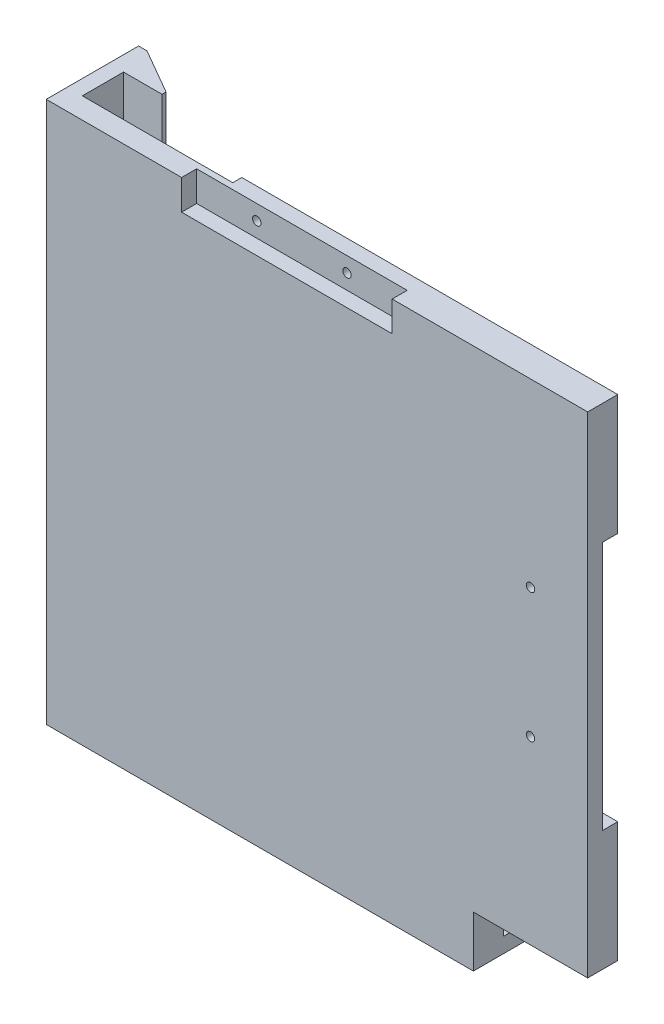
ISO-10303-21;
HEADER;
FILE_DESCRIPTION(('STEP AP214'),'2;1');
FILE_NAME('part.step','',(''),(''),'','','');
FILE_SCHEMA(('AUTOMOTIVE_DESIGN { 1 0 10303 214 1 1 1 1 }'));
ENDSEC;
DATA;
#1=APPLICATION_CONTEXT('core data for automotive mechanical design processes');
#2=APPLICATION_PROTOCOL_DEFINITION('international standard','automotive_design',2000,#1);
#3=PRODUCT_CONTEXT('',#1,'mechanical');
#4=PRODUCT('Part','Part','',(#3));
#5=PRODUCT_RELATED_PRODUCT_CATEGORY('part','',(#4));
#6=PRODUCT_DEFINITION_FORMATION('','',#4);
#7=PRODUCT_DEFINITION_CONTEXT('part definition',#1,'design');
#8=PRODUCT_DEFINITION('design','',#6,#7);
#9=PRODUCT_DEFINITION_SHAPE('','',#8);
#10=(LENGTH_UNIT() NAMED_UNIT(*) SI_UNIT(.MILLI.,.METRE.));
#11=(NAMED_UNIT(*) PLANE_ANGLE_UNIT() SI_UNIT($,.RADIAN.));
#12=(NAMED_UNIT(*) SI_UNIT($,.STERADIAN.) SOLID_ANGLE_UNIT());
#13=UNCERTAINTY_MEASURE_WITH_UNIT(LENGTH_MEASURE(1.E-05),#10,'distance_accuracy_value','');
#14=(GEOMETRIC_REPRESENTATION_CONTEXT(3) GLOBAL_UNCERTAINTY_ASSIGNED_CONTEXT((#13)) GLOBAL_UNIT_ASSIGNED_CONTEXT((#10,
#11,#12)) REPRESENTATION_CONTEXT('',''));
#15=CARTESIAN_POINT('',(0.,0.,0.));
#16=DIRECTION('',(0.,0.,1.));
#17=DIRECTION('',(1.,0.,0.));
#18=AXIS2_PLACEMENT_3D('',#15,#16,#17);
#19=CARTESIAN_POINT('',(180.,0.,30.7));
#20=DIRECTION('',(-1.,0.,0.));
#21=DIRECTION('',(0.,0.,1.));
#22=AXIS2_PLACEMENT_3D('',#19,#20,#21);
#23=PLANE('',#22);
#24=DIRECTION('',(0.,-1.,0.));
#25=VECTOR('',#24,1.);
#26=CARTESIAN_POINT('',(180.,57.01,25.7));
#27=LINE('',#26,#25);
#28=CARTESIAN_POINT('',(180.,140.,25.7));
#29=VERTEX_POINT('',#28);
#30=CARTESIAN_POINT('',(180.,57.01,25.7));
#31=VERTEX_POINT('',#30);
#32=EDGE_CURVE('E265',#29,#31,#27,.T.);
#33=ORIENTED_EDGE('',*,*,#32,.F.);
#34=DIRECTION('',(0.,0.,-1.));
#35=VECTOR('',#34,1.);
#36=CARTESIAN_POINT('',(180.,140.,25.7));
#37=LINE('',#36,#35);
#38=CARTESIAN_POINT('',(180.,140.,20.7));
#39=VERTEX_POINT('',#38);
#40=EDGE_CURVE('E285',#29,#39,#37,.T.);
#41=ORIENTED_EDGE('',*,*,#40,.T.);
#42=DIRECTION('',(0.,-1.,0.));
#43=VECTOR('',#42,1.);
#44=CARTESIAN_POINT('',(180.,17.01,20.7));
#45=LINE('',#44,#43);
#46=CARTESIAN_POINT('',(180.,180.,20.7));
#47=VERTEX_POINT('',#46);
#48=EDGE_CURVE('E337',#47,#39,#45,.T.);
#49=ORIENTED_EDGE('',*,*,#48,.F.);
#50=DIRECTION('',(0.,0.,-1.));
#51=VECTOR('',#50,1.);
#52=CARTESIAN_POINT('',(180.,180.,30.7));
#53=LINE('',#52,#51);
#54=CARTESIAN_POINT('',(180.,180.,30.7));
#55=VERTEX_POINT('',#54);
#56=EDGE_CURVE('E369',#55,#47,#53,.T.);
#57=ORIENTED_EDGE('',*,*,#56,.F.);
#58=DIRECTION('',(0.,1.,0.));
#59=VECTOR('',#58,1.);
#60=CARTESIAN_POINT('',(180.,0.,30.7));
#61=LINE('',#60,#59);
#62=CARTESIAN_POINT('',(180.,17.01,30.7));
#63=VERTEX_POINT('',#62);
#64=EDGE_CURVE('E354',#63,#55,#61,.T.);
#65=ORIENTED_EDGE('',*,*,#64,.F.);
#66=DIRECTION('',(0.,0.,-1.));
#67=VECTOR('',#66,1.);
#68=CARTESIAN_POINT('',(180.,17.01,30.7));
#69=LINE('',#68,#67);
#70=CARTESIAN_POINT('',(180.,17.01,20.7));
#71=VERTEX_POINT('',#70);
#72=EDGE_CURVE('E296',#63,#71,#69,.T.);
#73=ORIENTED_EDGE('',*,*,#72,.T.);
#74=CARTESIAN_POINT('',(180.,57.01,20.7));
#75=VERTEX_POINT('',#74);
#76=EDGE_CURVE('E336',#75,#71,#45,.T.);
#77=ORIENTED_EDGE('',*,*,#76,.F.);
#78=DIRECTION('',(0.,0.,-1.));
#79=VECTOR('',#78,1.);
#80=CARTESIAN_POINT('',(180.,57.01,25.7));
#81=LINE('',#80,#79);
#82=EDGE_CURVE('E278',#31,#75,#81,.T.);
#83=ORIENTED_EDGE('',*,*,#82,.F.);
#84=EDGE_LOOP('',(#33,#41,#49,#57,#65,#73,#77,#83));
#85=FACE_BOUND('',#84,.T.);
#86=ADVANCED_FACE('F41',(#85),#23,.F.);
#87=CARTESIAN_POINT('',(0.,0.,30.7));
#88=DIRECTION('',(1.,0.,0.));
#89=DIRECTION('',(0.,0.,-1.));
#90=AXIS2_PLACEMENT_3D('',#87,#88,#89);
#91=PLANE('',#90);
#92=DIRECTION('',(0.,-1.,0.));
#93=VECTOR('',#92,1.);
#94=CARTESIAN_POINT('',(0.,0.,0.));
#95=LINE('',#94,#93);
#96=CARTESIAN_POINT('',(0.,180.,0.));
#97=VERTEX_POINT('',#96);
#98=CARTESIAN_POINT('',(0.,0.,0.));
#99=VERTEX_POINT('',#98);
#100=EDGE_CURVE('E345',#97,#99,#95,.T.);
#101=ORIENTED_EDGE('',*,*,#100,.T.);
#102=DIRECTION('',(0.,0.,-1.));
#103=VECTOR('',#102,1.);
#104=CARTESIAN_POINT('',(0.,0.,30.7));
#105=LINE('',#104,#103);
#106=CARTESIAN_POINT('',(0.,0.,30.7));
#107=VERTEX_POINT('',#106);
#108=EDGE_CURVE('E372',#107,#99,#105,.T.);
#109=ORIENTED_EDGE('',*,*,#108,.F.);
#110=DIRECTION('',(0.,-1.,0.));
#111=VECTOR('',#110,1.);
#112=CARTESIAN_POINT('',(0.,0.,30.7));
#113=LINE('',#112,#111);
#114=CARTESIAN_POINT('',(0.,180.,30.7));
#115=VERTEX_POINT('',#114);
#116=EDGE_CURVE('E347',#115,#107,#113,.T.);
#117=ORIENTED_EDGE('',*,*,#116,.F.);
#118=DIRECTION('',(0.,0.,-1.));
#119=VECTOR('',#118,1.);
#120=CARTESIAN_POINT('',(0.,180.,30.7));
#121=LINE('',#120,#119);
#122=EDGE_CURVE('E360',#115,#97,#121,.T.);
#123=ORIENTED_EDGE('',*,*,#122,.T.);
#124=EDGE_LOOP('',(#101,#109,#117,#123));
#125=FACE_BOUND('',#124,.T.);
#126=ADVANCED_FACE('F503',(#125),#91,.F.);
#127=CARTESIAN_POINT('',(0.,0.,30.7));
#128=DIRECTION('',(0.,1.,0.));
#129=DIRECTION('',(0.,0.,1.));
#130=AXIS2_PLACEMENT_3D('',#127,#128,#129);
#131=PLANE('',#130);
#132=DIRECTION('',(1.,0.,0.));
#133=VECTOR('',#132,1.);
#134=CARTESIAN_POINT('',(0.,0.,0.));
#135=LINE('',#134,#133);
#136=CARTESIAN_POINT('',(142.,0.,0.));
#137=VERTEX_POINT('',#136);
#138=EDGE_CURVE('E363',#99,#137,#135,.T.);
#139=ORIENTED_EDGE('',*,*,#138,.T.);
#140=DIRECTION('',(0.,0.,-1.));
#141=VECTOR('',#140,1.);
#142=CARTESIAN_POINT('',(142.,0.,30.7));
#143=LINE('',#142,#141);
#144=CARTESIAN_POINT('',(142.,0.,30.7));
#145=VERTEX_POINT('',#144);
#146=EDGE_CURVE('E288',#145,#137,#143,.T.);
#147=ORIENTED_EDGE('',*,*,#146,.F.);
#148=DIRECTION('',(1.,0.,0.));
#149=VECTOR('',#148,1.);
#150=CARTESIAN_POINT('',(0.,0.,30.7));
#151=LINE('',#150,#149);
#152=EDGE_CURVE('E350',#107,#145,#151,.T.);
#153=ORIENTED_EDGE('',*,*,#152,.F.);
#154=ORIENTED_EDGE('',*,*,#108,.T.);
#155=EDGE_LOOP('',(#139,#147,#153,#154));
#156=FACE_BOUND('',#155,.T.);
#157=ADVANCED_FACE('F474',(#156),#131,.F.);
#158=CARTESIAN_POINT('',(0.,180.,30.7));
#159=DIRECTION('',(0.,-1.,0.));
#160=DIRECTION('',(0.,0.,-1.));
#161=AXIS2_PLACEMENT_3D('',#158,#159,#160);
#162=PLANE('',#161);
#163=DIRECTION('',(0.,0.,-1.));
#164=VECTOR('',#163,1.);
#165=CARTESIAN_POINT('',(17.79,180.,20.7));
#166=LINE('',#165,#164);
#167=CARTESIAN_POINT('',(17.79,180.,10.));
#168=VERTEX_POINT('',#167);
#169=CARTESIAN_POINT('',(17.79,180.,8.66025403784437));
#170=VERTEX_POINT('',#169);
#171=EDGE_CURVE('E343',#168,#170,#166,.T.);
#172=ORIENTED_EDGE('',*,*,#171,.T.);
#173=DIRECTION('',(-0.86602540378444,0.,-0.499999999999997));
#174=VECTOR('',#173,1.);
#175=CARTESIAN_POINT('',(17.79,180.,8.66025403784437));
#176=LINE('',#175,#174);
#177=CARTESIAN_POINT('',(2.7899999999999,180.,0.));
#178=VERTEX_POINT('',#177);
#179=EDGE_CURVE('E12',#170,#178,#176,.T.);
#180=ORIENTED_EDGE('',*,*,#179,.T.);
#181=DIRECTION('',(-1.,0.,0.));
#182=VECTOR('',#181,1.);
#183=CARTESIAN_POINT('',(0.,180.,0.));
#184=LINE('',#183,#182);
#185=EDGE_CURVE('E351',#178,#97,#184,.T.);
#186=ORIENTED_EDGE('',*,*,#185,.T.);
#187=ORIENTED_EDGE('',*,*,#122,.F.);
#188=DIRECTION('',(-1.,0.,0.));
#189=VECTOR('',#188,1.);
#190=CARTESIAN_POINT('',(0.,180.,30.7));
#191=LINE('',#190,#189);
#192=CARTESIAN_POINT('',(45.,180.,30.7));
#193=VERTEX_POINT('',#192);
#194=EDGE_CURVE('E356',#193,#115,#191,.T.);
#195=ORIENTED_EDGE('',*,*,#194,.F.);
#196=DIRECTION('',(0.,0.,1.));
#197=VECTOR('',#196,1.);
#198=CARTESIAN_POINT('',(45.,180.,25.7));
#199=LINE('',#198,#197);
#200=CARTESIAN_POINT('',(45.,180.,25.7));
#201=VERTEX_POINT('',#200);
#202=EDGE_CURVE('E239',#201,#193,#199,.T.);
#203=ORIENTED_EDGE('',*,*,#202,.F.);
#204=DIRECTION('',(-1.,0.,0.));
#205=VECTOR('',#204,1.);
#206=CARTESIAN_POINT('',(45.,180.,25.7));
#207=LINE('',#206,#205);
#208=CARTESIAN_POINT('',(115.,180.,25.7));
#209=VERTEX_POINT('',#208);
#210=EDGE_CURVE('E213',#209,#201,#207,.T.);
#211=ORIENTED_EDGE('',*,*,#210,.F.);
#212=DIRECTION('',(0.,0.,1.));
#213=VECTOR('',#212,1.);
#214=CARTESIAN_POINT('',(115.,180.,25.7));
#215=LINE('',#214,#213);
#216=CARTESIAN_POINT('',(115.,180.,30.7));
#217=VERTEX_POINT('',#216);
#218=EDGE_CURVE('E242',#209,#217,#215,.T.);
#219=ORIENTED_EDGE('',*,*,#218,.T.);
#220=EDGE_CURVE('E357',#55,#217,#191,.T.);
#221=ORIENTED_EDGE('',*,*,#220,.F.);
#222=ORIENTED_EDGE('',*,*,#56,.T.);
#223=DIRECTION('',(1.,0.,0.));
#224=VECTOR('',#223,1.);
#225=CARTESIAN_POINT('',(180.,180.,20.7));
#226=LINE('',#225,#224);
#227=CARTESIAN_POINT('',(55.,180.,20.7));
#228=VERTEX_POINT('',#227);
#229=EDGE_CURVE('E340',#228,#47,#226,.T.);
#230=ORIENTED_EDGE('',*,*,#229,.F.);
#231=DIRECTION('',(0.,0.,-1.));
#232=VECTOR('',#231,1.);
#233=CARTESIAN_POINT('',(55.,180.,23.7));
#234=LINE('',#233,#232);
#235=CARTESIAN_POINT('',(55.,180.,23.7));
#236=VERTEX_POINT('',#235);
#237=EDGE_CURVE('E258',#236,#228,#234,.T.);
#238=ORIENTED_EDGE('',*,*,#237,.F.);
#239=DIRECTION('',(1.,0.,0.));
#240=VECTOR('',#239,1.);
#241=CARTESIAN_POINT('',(5.,180.,23.7));
#242=LINE('',#241,#240);
#243=CARTESIAN_POINT('',(5.,180.,23.7));
#244=VERTEX_POINT('',#243);
#245=EDGE_CURVE('E249',#244,#236,#242,.T.);
#246=ORIENTED_EDGE('',*,*,#245,.F.);
#247=DIRECTION('',(0.,0.,1.));
#248=VECTOR('',#247,1.);
#249=CARTESIAN_POINT('',(5.,180.,20.7));
#250=LINE('',#249,#248);
#251=CARTESIAN_POINT('',(5.,180.,10.));
#252=VERTEX_POINT('',#251);
#253=EDGE_CURVE('E327',#252,#244,#250,.T.);
#254=ORIENTED_EDGE('',*,*,#253,.F.);
#255=DIRECTION('',(-1.,0.,0.));
#256=VECTOR('',#255,1.);
#257=CARTESIAN_POINT('',(180.,180.,10.));
#258=LINE('',#257,#256);
#259=EDGE_CURVE('E318',#168,#252,#258,.T.);
#260=ORIENTED_EDGE('',*,*,#259,.F.);
#261=EDGE_LOOP('',(#172,#180,#186,#187,#195,#203,#211,#219,#221,#222,#230,#238,#246,#254,#260));
#262=FACE_BOUND('',#261,.T.);
#263=ADVANCED_FACE('F441',(#262),#162,.F.);
#264=CARTESIAN_POINT('',(0.,0.,30.7));
#265=DIRECTION('',(0.,0.,-1.));
#266=DIRECTION('',(-1.,0.,0.));
#267=AXIS2_PLACEMENT_3D('',#264,#265,#266);
#268=PLANE('',#267);
#269=CARTESIAN_POINT('',(161.,77.01,30.7));
#270=DIRECTION('',(0.,0.,-1.));
#271=DIRECTION('',(-1.,0.,0.));
#272=AXIS2_PLACEMENT_3D('',#269,#270,#271);
#273=CIRCLE('',#272,1.40000000000003);
#274=CARTESIAN_POINT('',(159.6,77.01,30.7));
#275=VERTEX_POINT('',#274);
#276=EDGE_CURVE('E231',#275,#275,#273,.T.);
#277=ORIENTED_EDGE('',*,*,#276,.T.);
#278=EDGE_LOOP('',(#277));
#279=FACE_BOUND('',#278,.T.);
#280=CARTESIAN_POINT('',(161.,120.,30.7));
#281=DIRECTION('',(0.,0.,-1.));
#282=DIRECTION('',(-1.,0.,0.));
#283=AXIS2_PLACEMENT_3D('',#280,#281,#282);
#284=CIRCLE('',#283,1.40000000000003);
#285=CARTESIAN_POINT('',(159.6,120.,30.7));
#286=VERTEX_POINT('',#285);
#287=EDGE_CURVE('E398',#286,#286,#284,.T.);
#288=ORIENTED_EDGE('',*,*,#287,.T.);
#289=EDGE_LOOP('',(#288));
#290=FACE_BOUND('',#289,.T.);
#291=DIRECTION('',(1.,0.,0.));
#292=VECTOR('',#291,1.);
#293=CARTESIAN_POINT('',(45.,170.,30.7));
#294=LINE('',#293,#292);
#295=CARTESIAN_POINT('',(45.,170.,30.7));
#296=VERTEX_POINT('',#295);
#297=CARTESIAN_POINT('',(115.,170.,30.7));
#298=VERTEX_POINT('',#297);
#299=EDGE_CURVE('E228',#296,#298,#294,.T.);
#300=ORIENTED_EDGE('',*,*,#299,.F.);
#301=DIRECTION('',(0.,-1.,0.));
#302=VECTOR('',#301,1.);
#303=CARTESIAN_POINT('',(45.,170.,30.7));
#304=LINE('',#303,#302);
#305=EDGE_CURVE('E208',#193,#296,#304,.T.);
#306=ORIENTED_EDGE('',*,*,#305,.F.);
#307=ORIENTED_EDGE('',*,*,#194,.T.);
#308=ORIENTED_EDGE('',*,*,#116,.T.);
#309=ORIENTED_EDGE('',*,*,#152,.T.);
#310=DIRECTION('',(0.,-1.,0.));
#311=VECTOR('',#310,1.);
#312=CARTESIAN_POINT('',(142.,65.8617144018508,30.7));
#313=LINE('',#312,#311);
#314=CARTESIAN_POINT('',(142.,17.01,30.7));
#315=VERTEX_POINT('',#314);
#316=EDGE_CURVE('E303',#315,#145,#313,.T.);
#317=ORIENTED_EDGE('',*,*,#316,.F.);
#318=DIRECTION('',(1.,0.,0.));
#319=VECTOR('',#318,1.);
#320=CARTESIAN_POINT('',(180.,17.01,30.7));
#321=LINE('',#320,#319);
#322=EDGE_CURVE('E300',#315,#63,#321,.T.);
#323=ORIENTED_EDGE('',*,*,#322,.T.);
#324=ORIENTED_EDGE('',*,*,#64,.T.);
#325=ORIENTED_EDGE('',*,*,#220,.T.);
#326=DIRECTION('',(0.,1.,0.));
#327=VECTOR('',#326,1.);
#328=CARTESIAN_POINT('',(115.,170.,30.7));
#329=LINE('',#328,#327);
#330=EDGE_CURVE('E226',#298,#217,#329,.T.);
#331=ORIENTED_EDGE('',*,*,#330,.F.);
#332=EDGE_LOOP('',(#300,#306,#307,#308,#309,#317,#323,#324,#325,#331));
#333=FACE_BOUND('',#332,.T.);
#334=ADVANCED_FACE('F468',(#279,#290,#333),#268,.F.);
#335=CARTESIAN_POINT('',(0.,0.,0.));
#336=DIRECTION('',(0.,0.,-1.));
#337=DIRECTION('',(-1.,0.,0.));
#338=AXIS2_PLACEMENT_3D('',#335,#336,#337);
#339=PLANE('',#338);
#340=DIRECTION('',(0.,-1.,0.));
#341=VECTOR('',#340,1.);
#342=CARTESIAN_POINT('',(2.7899999999999,17.01,0.));
#343=LINE('',#342,#341);
#344=CARTESIAN_POINT('',(2.7899999999999,2.0099999999999,0.));
#345=VERTEX_POINT('',#344);
#346=EDGE_CURVE('E65',#178,#345,#343,.T.);
#347=ORIENTED_EDGE('',*,*,#346,.T.);
#348=DIRECTION('',(1.,0.,0.));
#349=VECTOR('',#348,1.);
#350=CARTESIAN_POINT('',(142.,2.0099999999999,0.));
#351=LINE('',#350,#349);
#352=CARTESIAN_POINT('',(142.,2.0099999999999,0.));
#353=VERTEX_POINT('',#352);
#354=EDGE_CURVE('E384',#345,#353,#351,.T.);
#355=ORIENTED_EDGE('',*,*,#354,.T.);
#356=DIRECTION('',(0.,-1.,0.));
#357=VECTOR('',#356,1.);
#358=CARTESIAN_POINT('',(142.,65.8617144018508,0.));
#359=LINE('',#358,#357);
#360=EDGE_CURVE('E304',#353,#137,#359,.T.);
#361=ORIENTED_EDGE('',*,*,#360,.T.);
#362=ORIENTED_EDGE('',*,*,#138,.F.);
#363=ORIENTED_EDGE('',*,*,#100,.F.);
#364=ORIENTED_EDGE('',*,*,#185,.F.);
#365=EDGE_LOOP('',(#347,#355,#361,#362,#363,#364));
#366=FACE_BOUND('',#365,.T.);
#367=ADVANCED_FACE('F477',(#366),#339,.T.);
#368=CARTESIAN_POINT('',(17.79,17.01,20.7));
#369=DIRECTION('',(-1.,0.,0.));
#370=DIRECTION('',(0.,0.,1.));
#371=AXIS2_PLACEMENT_3D('',#368,#369,#370);
#372=PLANE('',#371);
#373=DIRECTION('',(0.,0.,-1.));
#374=VECTOR('',#373,1.);
#375=CARTESIAN_POINT('',(17.79,17.01,20.7));
#376=LINE('',#375,#374);
#377=CARTESIAN_POINT('',(17.79,17.01,10.));
#378=VERTEX_POINT('',#377);
#379=CARTESIAN_POINT('',(17.79,17.01,8.66025403784437));
#380=VERTEX_POINT('',#379);
#381=EDGE_CURVE('E342',#378,#380,#376,.T.);
#382=ORIENTED_EDGE('',*,*,#381,.T.);
#383=DIRECTION('',(0.,1.,0.));
#384=VECTOR('',#383,1.);
#385=CARTESIAN_POINT('',(17.79,180.,8.66025403784437));
#386=LINE('',#385,#384);
#387=EDGE_CURVE('E50',#380,#170,#386,.T.);
#388=ORIENTED_EDGE('',*,*,#387,.T.);
#389=ORIENTED_EDGE('',*,*,#171,.F.);
#390=DIRECTION('',(0.,-1.,0.));
#391=VECTOR('',#390,1.);
#392=CARTESIAN_POINT('',(17.79,17.01,10.));
#393=LINE('',#392,#391);
#394=EDGE_CURVE('E333',#168,#378,#393,.T.);
#395=ORIENTED_EDGE('',*,*,#394,.T.);
#396=EDGE_LOOP('',(#382,#388,#389,#395));
#397=FACE_BOUND('',#396,.T.);
#398=ADVANCED_FACE('F486',(#397),#372,.F.);
#399=CARTESIAN_POINT('',(180.,17.01,20.7));
#400=DIRECTION('',(0.,-1.,0.));
#401=DIRECTION('',(0.,0.,-1.));
#402=AXIS2_PLACEMENT_3D('',#399,#400,#401);
#403=PLANE('',#402);
#404=DIRECTION('',(0.,0.,1.));
#405=VECTOR('',#404,1.);
#406=CARTESIAN_POINT('',(142.,17.01,30.7));
#407=LINE('',#406,#405);
#408=CARTESIAN_POINT('',(142.,17.01,8.66025403784437));
#409=VERTEX_POINT('',#408);
#410=CARTESIAN_POINT('',(142.,17.01,10.));
#411=VERTEX_POINT('',#410);
#412=EDGE_CURVE('E294',#409,#411,#407,.T.);
#413=ORIENTED_EDGE('',*,*,#412,.F.);
#414=DIRECTION('',(-1.,0.,0.));
#415=VECTOR('',#414,1.);
#416=CARTESIAN_POINT('',(17.79,17.01,8.66025403784437));
#417=LINE('',#416,#415);
#418=EDGE_CURVE('E380',#409,#380,#417,.T.);
#419=ORIENTED_EDGE('',*,*,#418,.T.);
#420=ORIENTED_EDGE('',*,*,#381,.F.);
#421=DIRECTION('',(1.,0.,0.));
#422=VECTOR('',#421,1.);
#423=CARTESIAN_POINT('',(180.,17.01,10.));
#424=LINE('',#423,#422);
#425=EDGE_CURVE('E375',#378,#411,#424,.T.);
#426=ORIENTED_EDGE('',*,*,#425,.T.);
#427=EDGE_LOOP('',(#413,#419,#420,#426));
#428=FACE_BOUND('',#427,.T.);
#429=ADVANCED_FACE('F419',(#428),#403,.F.);
#430=CARTESIAN_POINT('',(0.,0.,20.7));
#431=DIRECTION('',(0.,0.,1.));
#432=DIRECTION('',(1.,0.,0.));
#433=AXIS2_PLACEMENT_3D('',#430,#431,#432);
#434=PLANE('',#433);
#435=CARTESIAN_POINT('',(95.,175.,20.7));
#436=DIRECTION('',(0.,0.,-1.));
#437=DIRECTION('',(-1.,0.,0.));
#438=AXIS2_PLACEMENT_3D('',#435,#436,#437);
#439=CIRCLE('',#438,1.39999999999997);
#440=CARTESIAN_POINT('',(93.6,175.,20.7));
#441=VERTEX_POINT('',#440);
#442=EDGE_CURVE('E408',#441,#441,#439,.T.);
#443=ORIENTED_EDGE('',*,*,#442,.F.);
#444=EDGE_LOOP('',(#443));
#445=FACE_BOUND('',#444,.T.);
#446=CARTESIAN_POINT('',(65.,175.,20.7));
#447=DIRECTION('',(0.,0.,-1.));
#448=DIRECTION('',(-1.,0.,0.));
#449=AXIS2_PLACEMENT_3D('',#446,#447,#448);
#450=CIRCLE('',#449,1.40000000000002);
#451=CARTESIAN_POINT('',(63.6,175.,20.7));
#452=VERTEX_POINT('',#451);
#453=EDGE_CURVE('E394',#452,#452,#450,.T.);
#454=ORIENTED_EDGE('',*,*,#453,.F.);
#455=EDGE_LOOP('',(#454));
#456=FACE_BOUND('',#455,.T.);
#457=DIRECTION('',(-1.,0.,0.));
#458=VECTOR('',#457,1.);
#459=CARTESIAN_POINT('',(180.,5.,20.7));
#460=LINE('',#459,#458);
#461=CARTESIAN_POINT('',(142.,5.,20.7));
#462=VERTEX_POINT('',#461);
#463=CARTESIAN_POINT('',(55.,5.,20.7));
#464=VERTEX_POINT('',#463);
#465=EDGE_CURVE('E321',#462,#464,#460,.T.);
#466=ORIENTED_EDGE('',*,*,#465,.T.);
#467=DIRECTION('',(0.,-1.,0.));
#468=VECTOR('',#467,1.);
#469=CARTESIAN_POINT('',(55.,5.,20.7));
#470=LINE('',#469,#468);
#471=EDGE_CURVE('E241',#228,#464,#470,.T.);
#472=ORIENTED_EDGE('',*,*,#471,.F.);
#473=ORIENTED_EDGE('',*,*,#229,.T.);
#474=ORIENTED_EDGE('',*,*,#48,.T.);
#475=DIRECTION('',(1.,0.,0.));
#476=VECTOR('',#475,1.);
#477=CARTESIAN_POINT('',(180.,140.,20.7));
#478=LINE('',#477,#476);
#479=CARTESIAN_POINT('',(142.,140.,20.7));
#480=VERTEX_POINT('',#479);
#481=EDGE_CURVE('E269',#480,#39,#478,.T.);
#482=ORIENTED_EDGE('',*,*,#481,.F.);
#483=DIRECTION('',(0.,1.,0.));
#484=VECTOR('',#483,1.);
#485=CARTESIAN_POINT('',(142.,57.01,20.7));
#486=LINE('',#485,#484);
#487=CARTESIAN_POINT('',(142.,57.01,20.7));
#488=VERTEX_POINT('',#487);
#489=EDGE_CURVE('E281',#488,#480,#486,.T.);
#490=ORIENTED_EDGE('',*,*,#489,.F.);
#491=DIRECTION('',(-1.,0.,0.));
#492=VECTOR('',#491,1.);
#493=CARTESIAN_POINT('',(180.,57.01,20.7));
#494=LINE('',#493,#492);
#495=EDGE_CURVE('E263',#75,#488,#494,.T.);
#496=ORIENTED_EDGE('',*,*,#495,.F.);
#497=ORIENTED_EDGE('',*,*,#76,.T.);
#498=DIRECTION('',(1.,0.,0.));
#499=VECTOR('',#498,1.);
#500=CARTESIAN_POINT('',(0.,17.01,20.7));
#501=LINE('',#500,#499);
#502=CARTESIAN_POINT('',(142.,17.01,20.7));
#503=VERTEX_POINT('',#502);
#504=EDGE_CURVE('E315',#503,#71,#501,.T.);
#505=ORIENTED_EDGE('',*,*,#504,.F.);
#506=DIRECTION('',(0.,-1.,0.));
#507=VECTOR('',#506,1.);
#508=CARTESIAN_POINT('',(142.,0.,20.7));
#509=LINE('',#508,#507);
#510=EDGE_CURVE('E312',#503,#462,#509,.T.);
#511=ORIENTED_EDGE('',*,*,#510,.T.);
#512=EDGE_LOOP('',(#466,#472,#473,#474,#482,#490,#496,#497,#505,#511));
#513=FACE_BOUND('',#512,.T.);
#514=ADVANCED_FACE('F415',(#445,#456,#513),#434,.F.);
#515=CARTESIAN_POINT('',(180.,-175.326809130834,10.));
#516=DIRECTION('',(0.,0.,-1.));
#517=DIRECTION('',(-1.,0.,0.));
#518=AXIS2_PLACEMENT_3D('',#515,#516,#517);
#519=PLANE('',#518);
#520=DIRECTION('',(1.,0.,0.));
#521=VECTOR('',#520,1.);
#522=CARTESIAN_POINT('',(180.,5.,10.));
#523=LINE('',#522,#521);
#524=CARTESIAN_POINT('',(5.,4.99999999999995,10.));
#525=VERTEX_POINT('',#524);
#526=CARTESIAN_POINT('',(142.,5.,10.));
#527=VERTEX_POINT('',#526);
#528=EDGE_CURVE('E325',#525,#527,#523,.T.);
#529=ORIENTED_EDGE('',*,*,#528,.T.);
#530=DIRECTION('',(0.,1.,0.));
#531=VECTOR('',#530,1.);
#532=CARTESIAN_POINT('',(142.,-175.326809130834,10.));
#533=LINE('',#532,#531);
#534=EDGE_CURVE('E309',#527,#411,#533,.T.);
#535=ORIENTED_EDGE('',*,*,#534,.T.);
#536=ORIENTED_EDGE('',*,*,#425,.F.);
#537=ORIENTED_EDGE('',*,*,#394,.F.);
#538=ORIENTED_EDGE('',*,*,#259,.T.);
#539=DIRECTION('',(0.,1.,0.));
#540=VECTOR('',#539,1.);
#541=CARTESIAN_POINT('',(5.,-175.326809130834,10.));
#542=LINE('',#541,#540);
#543=EDGE_CURVE('E322',#525,#252,#542,.T.);
#544=ORIENTED_EDGE('',*,*,#543,.F.);
#545=EDGE_LOOP('',(#529,#535,#536,#537,#538,#544));
#546=FACE_BOUND('',#545,.T.);
#547=ADVANCED_FACE('F418',(#546),#519,.F.);
#548=CARTESIAN_POINT('',(5.,-175.326809130834,20.7));
#549=DIRECTION('',(-1.,0.,0.));
#550=DIRECTION('',(0.,0.,1.));
#551=AXIS2_PLACEMENT_3D('',#548,#549,#550);
#552=PLANE('',#551);
#553=DIRECTION('',(0.,0.,-1.));
#554=VECTOR('',#553,1.);
#555=CARTESIAN_POINT('',(5.,5.,20.7));
#556=LINE('',#555,#554);
#557=CARTESIAN_POINT('',(5.,5.,23.7));
#558=VERTEX_POINT('',#557);
#559=EDGE_CURVE('E319',#558,#525,#556,.T.);
#560=ORIENTED_EDGE('',*,*,#559,.T.);
#561=ORIENTED_EDGE('',*,*,#543,.T.);
#562=ORIENTED_EDGE('',*,*,#253,.T.);
#563=DIRECTION('',(0.,1.,0.));
#564=VECTOR('',#563,1.);
#565=CARTESIAN_POINT('',(5.,5.,23.7));
#566=LINE('',#565,#564);
#567=EDGE_CURVE('E246',#558,#244,#566,.T.);
#568=ORIENTED_EDGE('',*,*,#567,.F.);
#569=EDGE_LOOP('',(#560,#561,#562,#568));
#570=FACE_BOUND('',#569,.T.);
#571=ADVANCED_FACE('F492',(#570),#552,.F.);
#572=CARTESIAN_POINT('',(0.,5.,30.7));
#573=DIRECTION('',(0.,1.,0.));
#574=DIRECTION('',(0.,0.,1.));
#575=AXIS2_PLACEMENT_3D('',#572,#573,#574);
#576=PLANE('',#575);
#577=DIRECTION('',(0.,0.,1.));
#578=VECTOR('',#577,1.);
#579=CARTESIAN_POINT('',(142.,5.,30.7));
#580=LINE('',#579,#578);
#581=EDGE_CURVE('E378',#527,#462,#580,.T.);
#582=ORIENTED_EDGE('',*,*,#581,.F.);
#583=ORIENTED_EDGE('',*,*,#528,.F.);
#584=ORIENTED_EDGE('',*,*,#559,.F.);
#585=DIRECTION('',(-1.,0.,0.));
#586=VECTOR('',#585,1.);
#587=CARTESIAN_POINT('',(5.,5.,23.7));
#588=LINE('',#587,#586);
#589=CARTESIAN_POINT('',(55.,5.,23.7));
#590=VERTEX_POINT('',#589);
#591=EDGE_CURVE('E255',#590,#558,#588,.T.);
#592=ORIENTED_EDGE('',*,*,#591,.F.);
#593=DIRECTION('',(0.,0.,-1.));
#594=VECTOR('',#593,1.);
#595=CARTESIAN_POINT('',(55.,5.,23.7));
#596=LINE('',#595,#594);
#597=EDGE_CURVE('E260',#590,#464,#596,.T.);
#598=ORIENTED_EDGE('',*,*,#597,.T.);
#599=ORIENTED_EDGE('',*,*,#465,.F.);
#600=EDGE_LOOP('',(#582,#583,#584,#592,#598,#599));
#601=FACE_BOUND('',#600,.T.);
#602=ADVANCED_FACE('F429',(#601),#576,.T.);
#603=CARTESIAN_POINT('',(180.,17.01,20.7));
#604=DIRECTION('',(0.,-1.,0.));
#605=DIRECTION('',(0.,0.,-1.));
#606=AXIS2_PLACEMENT_3D('',#603,#604,#605);
#607=PLANE('',#606);
#608=ORIENTED_EDGE('',*,*,#504,.T.);
#609=ORIENTED_EDGE('',*,*,#72,.F.);
#610=ORIENTED_EDGE('',*,*,#322,.F.);
#611=EDGE_CURVE('E297',#503,#315,#407,.T.);
#612=ORIENTED_EDGE('',*,*,#611,.F.);
#613=EDGE_LOOP('',(#608,#609,#610,#612));
#614=FACE_BOUND('',#613,.T.);
#615=ADVANCED_FACE('F464',(#614),#607,.T.);
#616=CARTESIAN_POINT('',(142.,65.8617144018508,30.7));
#617=DIRECTION('',(-1.,0.,0.));
#618=DIRECTION('',(0.,0.,1.));
#619=AXIS2_PLACEMENT_3D('',#616,#617,#618);
#620=PLANE('',#619);
#621=ORIENTED_EDGE('',*,*,#360,.F.);
#622=DIRECTION('',(0.,0.86602540378444,0.499999999999997));
#623=VECTOR('',#622,1.);
#624=CARTESIAN_POINT('',(142.,17.01,8.66025403784437));
#625=LINE('',#624,#623);
#626=EDGE_CURVE('E386',#353,#409,#625,.T.);
#627=ORIENTED_EDGE('',*,*,#626,.T.);
#628=ORIENTED_EDGE('',*,*,#412,.T.);
#629=ORIENTED_EDGE('',*,*,#534,.F.);
#630=ORIENTED_EDGE('',*,*,#581,.T.);
#631=ORIENTED_EDGE('',*,*,#510,.F.);
#632=ORIENTED_EDGE('',*,*,#611,.T.);
#633=ORIENTED_EDGE('',*,*,#316,.T.);
#634=ORIENTED_EDGE('',*,*,#146,.T.);
#635=EDGE_LOOP('',(#621,#627,#628,#629,#630,#631,#632,#633,#634));
#636=FACE_BOUND('',#635,.T.);
#637=ADVANCED_FACE('F472',(#636),#620,.F.);
#638=CARTESIAN_POINT('',(180.,140.,25.7));
#639=DIRECTION('',(0.,1.,0.));
#640=DIRECTION('',(0.,0.,1.));
#641=AXIS2_PLACEMENT_3D('',#638,#639,#640);
#642=PLANE('',#641);
#643=ORIENTED_EDGE('',*,*,#481,.T.);
#644=ORIENTED_EDGE('',*,*,#40,.F.);
#645=DIRECTION('',(1.,0.,0.));
#646=VECTOR('',#645,1.);
#647=CARTESIAN_POINT('',(180.,140.,25.7));
#648=LINE('',#647,#646);
#649=CARTESIAN_POINT('',(142.,140.,25.7));
#650=VERTEX_POINT('',#649);
#651=EDGE_CURVE('E275',#650,#29,#648,.T.);
#652=ORIENTED_EDGE('',*,*,#651,.F.);
#653=DIRECTION('',(0.,0.,-1.));
#654=VECTOR('',#653,1.);
#655=CARTESIAN_POINT('',(142.,140.,25.7));
#656=LINE('',#655,#654);
#657=EDGE_CURVE('E289',#650,#480,#656,.T.);
#658=ORIENTED_EDGE('',*,*,#657,.T.);
#659=EDGE_LOOP('',(#643,#644,#652,#658));
#660=FACE_BOUND('',#659,.T.);
#661=ADVANCED_FACE('F452',(#660),#642,.F.);
#662=CARTESIAN_POINT('',(142.,57.01,25.7));
#663=DIRECTION('',(-1.,0.,0.));
#664=DIRECTION('',(0.,0.,1.));
#665=AXIS2_PLACEMENT_3D('',#662,#663,#664);
#666=PLANE('',#665);
#667=ORIENTED_EDGE('',*,*,#489,.T.);
#668=ORIENTED_EDGE('',*,*,#657,.F.);
#669=DIRECTION('',(0.,1.,0.));
#670=VECTOR('',#669,1.);
#671=CARTESIAN_POINT('',(142.,57.01,25.7));
#672=LINE('',#671,#670);
#673=CARTESIAN_POINT('',(142.,57.01,25.7));
#674=VERTEX_POINT('',#673);
#675=EDGE_CURVE('E272',#674,#650,#672,.T.);
#676=ORIENTED_EDGE('',*,*,#675,.F.);
#677=DIRECTION('',(0.,0.,-1.));
#678=VECTOR('',#677,1.);
#679=CARTESIAN_POINT('',(142.,57.01,25.7));
#680=LINE('',#679,#678);
#681=EDGE_CURVE('E291',#674,#488,#680,.T.);
#682=ORIENTED_EDGE('',*,*,#681,.T.);
#683=EDGE_LOOP('',(#667,#668,#676,#682));
#684=FACE_BOUND('',#683,.T.);
#685=ADVANCED_FACE('F457',(#684),#666,.F.);
#686=CARTESIAN_POINT('',(180.,57.01,25.7));
#687=DIRECTION('',(0.,-1.,0.));
#688=DIRECTION('',(1.,0.,0.));
#689=AXIS2_PLACEMENT_3D('',#686,#687,#688);
#690=PLANE('',#689);
#691=ORIENTED_EDGE('',*,*,#495,.T.);
#692=ORIENTED_EDGE('',*,*,#681,.F.);
#693=DIRECTION('',(-1.,0.,0.));
#694=VECTOR('',#693,1.);
#695=CARTESIAN_POINT('',(180.,57.01,25.7));
#696=LINE('',#695,#694);
#697=EDGE_CURVE('E268',#31,#674,#696,.T.);
#698=ORIENTED_EDGE('',*,*,#697,.F.);
#699=ORIENTED_EDGE('',*,*,#82,.T.);
#700=EDGE_LOOP('',(#691,#692,#698,#699));
#701=FACE_BOUND('',#700,.T.);
#702=ADVANCED_FACE('F552',(#701),#690,.F.);
#703=CARTESIAN_POINT('',(0.,0.,25.7));
#704=DIRECTION('',(0.,0.,1.));
#705=DIRECTION('',(1.,0.,0.));
#706=AXIS2_PLACEMENT_3D('',#703,#704,#705);
#707=PLANE('',#706);
#708=CARTESIAN_POINT('',(161.,77.01,25.7));
#709=DIRECTION('',(0.,0.,1.));
#710=DIRECTION('',(1.,0.,0.));
#711=AXIS2_PLACEMENT_3D('',#708,#709,#710);
#712=CIRCLE('',#711,1.40000000000003);
#713=CARTESIAN_POINT('',(162.4,77.01,25.7));
#714=VERTEX_POINT('',#713);
#715=EDGE_CURVE('E45',#714,#714,#712,.T.);
#716=ORIENTED_EDGE('',*,*,#715,.T.);
#717=EDGE_LOOP('',(#716));
#718=FACE_BOUND('',#717,.T.);
#719=CARTESIAN_POINT('',(161.,120.,25.7));
#720=DIRECTION('',(0.,0.,1.));
#721=DIRECTION('',(1.,0.,0.));
#722=AXIS2_PLACEMENT_3D('',#719,#720,#721);
#723=CIRCLE('',#722,1.40000000000003);
#724=CARTESIAN_POINT('',(162.4,120.,25.7));
#725=VERTEX_POINT('',#724);
#726=EDGE_CURVE('E396',#725,#725,#723,.T.);
#727=ORIENTED_EDGE('',*,*,#726,.T.);
#728=EDGE_LOOP('',(#727));
#729=FACE_BOUND('',#728,.T.);
#730=ORIENTED_EDGE('',*,*,#32,.T.);
#731=ORIENTED_EDGE('',*,*,#697,.T.);
#732=ORIENTED_EDGE('',*,*,#675,.T.);
#733=ORIENTED_EDGE('',*,*,#651,.T.);
#734=EDGE_LOOP('',(#730,#731,#732,#733));
#735=FACE_BOUND('',#734,.T.);
#736=ADVANCED_FACE('F454',(#718,#729,#735),#707,.F.);
#737=CARTESIAN_POINT('',(55.,5.,23.7));
#738=DIRECTION('',(1.,0.,0.));
#739=DIRECTION('',(0.,0.,-1.));
#740=AXIS2_PLACEMENT_3D('',#737,#738,#739);
#741=PLANE('',#740);
#742=ORIENTED_EDGE('',*,*,#471,.T.);
#743=ORIENTED_EDGE('',*,*,#597,.F.);
#744=DIRECTION('',(0.,-1.,0.));
#745=VECTOR('',#744,1.);
#746=CARTESIAN_POINT('',(55.,5.,23.7));
#747=LINE('',#746,#745);
#748=EDGE_CURVE('E252',#236,#590,#747,.T.);
#749=ORIENTED_EDGE('',*,*,#748,.F.);
#750=ORIENTED_EDGE('',*,*,#237,.T.);
#751=EDGE_LOOP('',(#742,#743,#749,#750));
#752=FACE_BOUND('',#751,.T.);
#753=ADVANCED_FACE('F433',(#752),#741,.F.);
#754=CARTESIAN_POINT('',(0.,0.,23.7));
#755=DIRECTION('',(0.,0.,-1.));
#756=DIRECTION('',(-1.,0.,0.));
#757=AXIS2_PLACEMENT_3D('',#754,#755,#756);
#758=PLANE('',#757);
#759=ORIENTED_EDGE('',*,*,#567,.T.);
#760=ORIENTED_EDGE('',*,*,#245,.T.);
#761=ORIENTED_EDGE('',*,*,#748,.T.);
#762=ORIENTED_EDGE('',*,*,#591,.T.);
#763=EDGE_LOOP('',(#759,#760,#761,#762));
#764=FACE_BOUND('',#763,.T.);
#765=ADVANCED_FACE('F435',(#764),#758,.T.);
#766=CARTESIAN_POINT('',(45.,170.,25.7));
#767=DIRECTION('',(-1.,0.,0.));
#768=DIRECTION('',(0.,0.,1.));
#769=AXIS2_PLACEMENT_3D('',#766,#767,#768);
#770=PLANE('',#769);
#771=ORIENTED_EDGE('',*,*,#305,.T.);
#772=DIRECTION('',(0.,0.,1.));
#773=VECTOR('',#772,1.);
#774=CARTESIAN_POINT('',(45.,170.,25.7));
#775=LINE('',#774,#773);
#776=CARTESIAN_POINT('',(45.,170.,25.7));
#777=VERTEX_POINT('',#776);
#778=EDGE_CURVE('E201',#777,#296,#775,.T.);
#779=ORIENTED_EDGE('',*,*,#778,.F.);
#780=DIRECTION('',(0.,-1.,0.));
#781=VECTOR('',#780,1.);
#782=CARTESIAN_POINT('',(45.,170.,25.7));
#783=LINE('',#782,#781);
#784=EDGE_CURVE('E205',#201,#777,#783,.T.);
#785=ORIENTED_EDGE('',*,*,#784,.F.);
#786=ORIENTED_EDGE('',*,*,#202,.T.);
#787=EDGE_LOOP('',(#771,#779,#785,#786));
#788=FACE_BOUND('',#787,.T.);
#789=ADVANCED_FACE('F203',(#788),#770,.F.);
#790=CARTESIAN_POINT('',(115.,170.,25.7));
#791=DIRECTION('',(1.,0.,0.));
#792=DIRECTION('',(0.,0.,-1.));
#793=AXIS2_PLACEMENT_3D('',#790,#791,#792);
#794=PLANE('',#793);
#795=ORIENTED_EDGE('',*,*,#330,.T.);
#796=ORIENTED_EDGE('',*,*,#218,.F.);
#797=DIRECTION('',(0.,1.,0.));
#798=VECTOR('',#797,1.);
#799=CARTESIAN_POINT('',(115.,170.,25.7));
#800=LINE('',#799,#798);
#801=CARTESIAN_POINT('',(115.,170.,25.7));
#802=VERTEX_POINT('',#801);
#803=EDGE_CURVE('E221',#802,#209,#800,.T.);
#804=ORIENTED_EDGE('',*,*,#803,.F.);
#805=DIRECTION('',(0.,0.,1.));
#806=VECTOR('',#805,1.);
#807=CARTESIAN_POINT('',(115.,170.,25.7));
#808=LINE('',#807,#806);
#809=EDGE_CURVE('E212',#802,#298,#808,.T.);
#810=ORIENTED_EDGE('',*,*,#809,.T.);
#811=EDGE_LOOP('',(#795,#796,#804,#810));
#812=FACE_BOUND('',#811,.T.);
#813=ADVANCED_FACE('F536',(#812),#794,.F.);
#814=CARTESIAN_POINT('',(45.,170.,25.7));
#815=DIRECTION('',(0.,-1.,0.));
#816=DIRECTION('',(0.,0.,-1.));
#817=AXIS2_PLACEMENT_3D('',#814,#815,#816);
#818=PLANE('',#817);
#819=ORIENTED_EDGE('',*,*,#299,.T.);
#820=ORIENTED_EDGE('',*,*,#809,.F.);
#821=DIRECTION('',(1.,0.,0.));
#822=VECTOR('',#821,1.);
#823=CARTESIAN_POINT('',(45.,170.,25.7));
#824=LINE('',#823,#822);
#825=EDGE_CURVE('E216',#777,#802,#824,.T.);
#826=ORIENTED_EDGE('',*,*,#825,.F.);
#827=ORIENTED_EDGE('',*,*,#778,.T.);
#828=EDGE_LOOP('',(#819,#820,#826,#827));
#829=FACE_BOUND('',#828,.T.);
#830=ADVANCED_FACE('F217',(#829),#818,.F.);
#831=CARTESIAN_POINT('',(0.,0.,25.7));
#832=DIRECTION('',(0.,0.,-1.));
#833=DIRECTION('',(-1.,0.,0.));
#834=AXIS2_PLACEMENT_3D('',#831,#832,#833);
#835=PLANE('',#834);
#836=CARTESIAN_POINT('',(95.,175.,25.7));
#837=DIRECTION('',(0.,0.,-1.));
#838=DIRECTION('',(-1.,0.,0.));
#839=AXIS2_PLACEMENT_3D('',#836,#837,#838);
#840=CIRCLE('',#839,1.39999999999997);
#841=CARTESIAN_POINT('',(93.6,175.,25.7));
#842=VERTEX_POINT('',#841);
#843=EDGE_CURVE('E393',#842,#842,#840,.T.);
#844=ORIENTED_EDGE('',*,*,#843,.T.);
#845=EDGE_LOOP('',(#844));
#846=FACE_BOUND('',#845,.T.);
#847=CARTESIAN_POINT('',(65.,175.,25.7));
#848=DIRECTION('',(0.,0.,-1.));
#849=DIRECTION('',(-1.,0.,0.));
#850=AXIS2_PLACEMENT_3D('',#847,#848,#849);
#851=CIRCLE('',#850,1.40000000000002);
#852=CARTESIAN_POINT('',(63.6,175.,25.7));
#853=VERTEX_POINT('',#852);
#854=EDGE_CURVE('E390',#853,#853,#851,.T.);
#855=ORIENTED_EDGE('',*,*,#854,.T.);
#856=EDGE_LOOP('',(#855));
#857=FACE_BOUND('',#856,.T.);
#858=ORIENTED_EDGE('',*,*,#784,.T.);
#859=ORIENTED_EDGE('',*,*,#825,.T.);
#860=ORIENTED_EDGE('',*,*,#803,.T.);
#861=ORIENTED_EDGE('',*,*,#210,.T.);
#862=EDGE_LOOP('',(#858,#859,#860,#861));
#863=FACE_BOUND('',#862,.T.);
#864=ADVANCED_FACE('F223',(#846,#857,#863),#835,.F.);
#865=CARTESIAN_POINT('',(17.79,17.01,8.66025403784437));
#866=DIRECTION('',(0.499999999999997,0.,-0.86602540378444));
#867=DIRECTION('',(0.,-1.,0.));
#868=AXIS2_PLACEMENT_3D('',#865,#866,#867);
#869=PLANE('',#868);
#870=ORIENTED_EDGE('',*,*,#179,.F.);
#871=ORIENTED_EDGE('',*,*,#387,.F.);
#872=DIRECTION('',(-0.654653670707978,-0.654653670707978,-0.377964473009225));
#873=VECTOR('',#872,1.);
#874=CARTESIAN_POINT('',(87.3085714285716,86.5285714285716,48.7968199658081));
#875=LINE('',#874,#873);
#876=EDGE_CURVE('E237',#345,#380,#875,.F.);
#877=ORIENTED_EDGE('',*,*,#876,.F.);
#878=ORIENTED_EDGE('',*,*,#346,.F.);
#879=EDGE_LOOP('',(#870,#871,#877,#878));
#880=FACE_BOUND('',#879,.T.);
#881=ADVANCED_FACE('F43',(#880),#869,.T.);
#882=CARTESIAN_POINT('',(180.,17.01,8.66025403784437));
#883=DIRECTION('',(0.,0.499999999999997,-0.86602540378444));
#884=DIRECTION('',(1.,0.,0.));
#885=AXIS2_PLACEMENT_3D('',#882,#883,#884);
#886=PLANE('',#885);
#887=ORIENTED_EDGE('',*,*,#626,.F.);
#888=ORIENTED_EDGE('',*,*,#354,.F.);
#889=ORIENTED_EDGE('',*,*,#876,.T.);
#890=ORIENTED_EDGE('',*,*,#418,.F.);
#891=EDGE_LOOP('',(#887,#888,#889,#890));
#892=FACE_BOUND('',#891,.T.);
#893=ADVANCED_FACE('F482',(#892),#886,.T.);
#894=CARTESIAN_POINT('',(65.,175.,40.7));
#895=DIRECTION('',(0.,0.,-1.));
#896=DIRECTION('',(-1.,0.,0.));
#897=AXIS2_PLACEMENT_3D('',#894,#895,#896);
#898=CYLINDRICAL_SURFACE('',#897,1.40000000000002);
#899=ORIENTED_EDGE('',*,*,#453,.T.);
#900=EDGE_LOOP('',(#899));
#901=FACE_BOUND('',#900,.T.);
#902=ORIENTED_EDGE('',*,*,#854,.F.);
#903=EDGE_LOOP('',(#902));
#904=FACE_BOUND('',#903,.T.);
#905=ADVANCED_FACE('F517',(#901,#904),#898,.F.);
#906=CARTESIAN_POINT('',(95.,175.,40.7));
#907=DIRECTION('',(0.,0.,-1.));
#908=DIRECTION('',(-1.,0.,0.));
#909=AXIS2_PLACEMENT_3D('',#906,#907,#908);
#910=CYLINDRICAL_SURFACE('',#909,1.39999999999997);
#911=ORIENTED_EDGE('',*,*,#442,.T.);
#912=EDGE_LOOP('',(#911));
#913=FACE_BOUND('',#912,.T.);
#914=ORIENTED_EDGE('',*,*,#843,.F.);
#915=EDGE_LOOP('',(#914));
#916=FACE_BOUND('',#915,.T.);
#917=ADVANCED_FACE('F412',(#913,#916),#910,.F.);
#918=CARTESIAN_POINT('',(161.,120.,40.7));
#919=DIRECTION('',(0.,0.,-1.));
#920=DIRECTION('',(-1.,0.,0.));
#921=AXIS2_PLACEMENT_3D('',#918,#919,#920);
#922=CYLINDRICAL_SURFACE('',#921,1.40000000000003);
#923=ORIENTED_EDGE('',*,*,#726,.F.);
#924=EDGE_LOOP('',(#923));
#925=FACE_BOUND('',#924,.T.);
#926=ORIENTED_EDGE('',*,*,#287,.F.);
#927=EDGE_LOOP('',(#926));
#928=FACE_BOUND('',#927,.T.);
#929=ADVANCED_FACE('F610',(#925,#928),#922,.F.);
#930=CARTESIAN_POINT('',(161.,77.01,40.7));
#931=DIRECTION('',(0.,0.,-1.));
#932=DIRECTION('',(-1.,0.,0.));
#933=AXIS2_PLACEMENT_3D('',#930,#931,#932);
#934=CYLINDRICAL_SURFACE('',#933,1.40000000000003);
#935=ORIENTED_EDGE('',*,*,#715,.F.);
#936=EDGE_LOOP('',(#935));
#937=FACE_BOUND('',#936,.T.);
#938=ORIENTED_EDGE('',*,*,#276,.F.);
#939=EDGE_LOOP('',(#938));
#940=FACE_BOUND('',#939,.T.);
#941=ADVANCED_FACE('F619',(#937,#940),#934,.F.);
#942=CLOSED_SHELL('',(#86,#126,#157,#263,#334,#367,#398,#429,#514,#547,#571,#602,#615,#637,#661,
#685,#702,#736,#753,#765,#789,#813,#830,#864,#881,#893,#905,#917,#929,#941));
#943=MANIFOLD_SOLID_BREP('B2',#942);
#944=ADVANCED_BREP_SHAPE_REPRESENTATION('',(#18,#943),#14);
#945=SHAPE_DEFINITION_REPRESENTATION(#9,#944);
ENDSEC;
END-ISO-10303-21;
